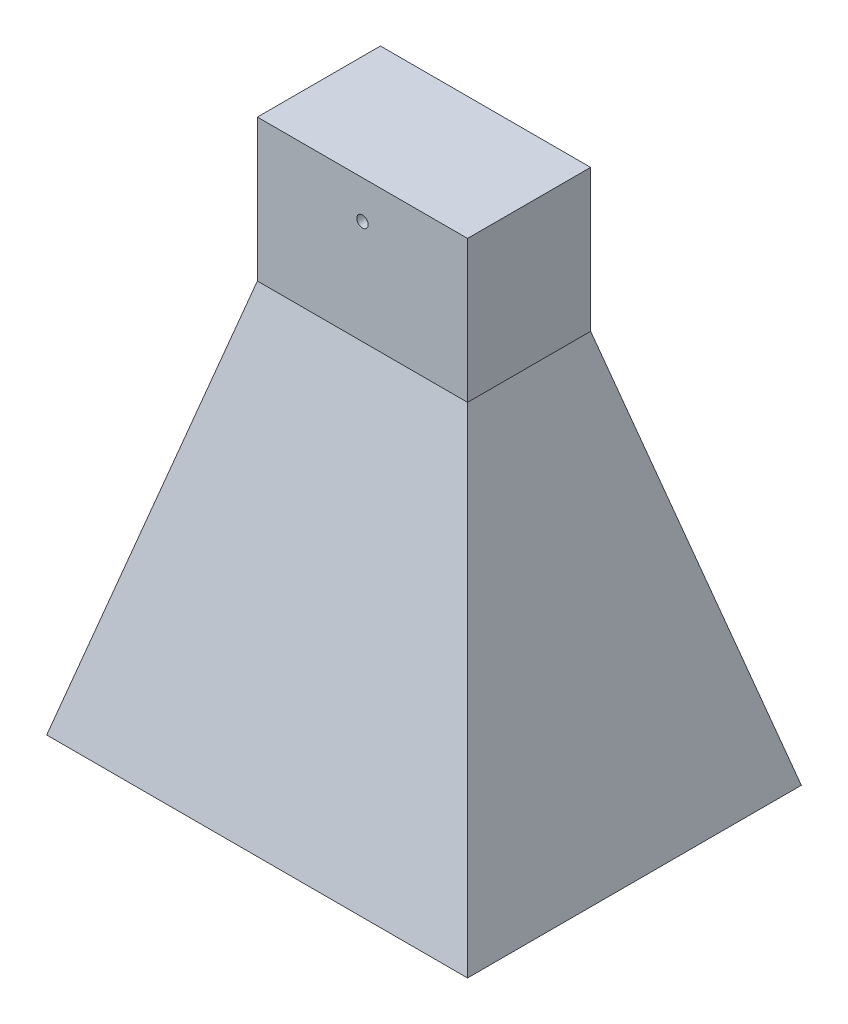
ISO-10303-21;
HEADER;
FILE_DESCRIPTION(('STEP AP214'),'2;1');
FILE_NAME('part.step','',(''),(''),'','','');
FILE_SCHEMA(('AUTOMOTIVE_DESIGN { 1 0 10303 214 1 1 1 1 }'));
ENDSEC;
DATA;
#1=APPLICATION_CONTEXT('core data for automotive mechanical design processes');
#2=APPLICATION_PROTOCOL_DEFINITION('international standard','automotive_design',2000,#1);
#3=PRODUCT_CONTEXT('',#1,'mechanical');
#4=PRODUCT('Part','Part','',(#3));
#5=PRODUCT_RELATED_PRODUCT_CATEGORY('part','',(#4));
#6=PRODUCT_DEFINITION_FORMATION('','',#4);
#7=PRODUCT_DEFINITION_CONTEXT('part definition',#1,'design');
#8=PRODUCT_DEFINITION('design','',#6,#7);
#9=PRODUCT_DEFINITION_SHAPE('','',#8);
#10=(LENGTH_UNIT() NAMED_UNIT(*) SI_UNIT(.MILLI.,.METRE.));
#11=(NAMED_UNIT(*) PLANE_ANGLE_UNIT() SI_UNIT($,.RADIAN.));
#12=(NAMED_UNIT(*) SI_UNIT($,.STERADIAN.) SOLID_ANGLE_UNIT());
#13=UNCERTAINTY_MEASURE_WITH_UNIT(LENGTH_MEASURE(1.E-05),#10,'distance_accuracy_value','');
#14=(GEOMETRIC_REPRESENTATION_CONTEXT(3) GLOBAL_UNCERTAINTY_ASSIGNED_CONTEXT((#13)) GLOBAL_UNIT_ASSIGNED_CONTEXT((#10,
#11,#12)) REPRESENTATION_CONTEXT('',''));
#15=CARTESIAN_POINT('',(0.,0.,0.));
#16=DIRECTION('',(0.,0.,1.));
#17=DIRECTION('',(1.,0.,0.));
#18=AXIS2_PLACEMENT_3D('',#15,#16,#17);
#19=CARTESIAN_POINT('',(0.,0.,-590.));
#20=DIRECTION('',(0.,0.258819045102521,-0.965925826289068));
#21=DIRECTION('',(0.,0.965925826289068,0.258819045102521));
#22=AXIS2_PLACEMENT_3D('',#19,#20,#21);
#23=PLANE('',#22);
#24=DIRECTION('',(1.,0.,0.));
#25=VECTOR('',#24,1.);
#26=CARTESIAN_POINT('',(0.,0.,-590.));
#27=LINE('',#26,#25);
#28=CARTESIAN_POINT('',(0.,0.,-590.));
#29=VERTEX_POINT('',#28);
#30=CARTESIAN_POINT('',(744.,0.,-590.));
#31=VERTEX_POINT('',#30);
#32=EDGE_CURVE('E178',#29,#31,#27,.T.);
#33=ORIENTED_EDGE('',*,*,#32,.F.);
#34=DIRECTION('',(-0.250562807085732,-0.935113126531029,-0.250562807085732));
#35=VECTOR('',#34,1.);
#36=CARTESIAN_POINT('',(37.0412149738623,138.239696256535,-552.958785026138));
#37=LINE('',#36,#35);
#38=CARTESIAN_POINT('',(186.224688739631,695.,-403.775311260369));
#39=VERTEX_POINT('',#38);
#40=EDGE_CURVE('E11',#39,#29,#37,.T.);
#41=ORIENTED_EDGE('',*,*,#40,.F.);
#42=DIRECTION('',(1.,0.,0.));
#43=VECTOR('',#42,1.);
#44=CARTESIAN_POINT('',(0.,695.,-403.775311260369));
#45=LINE('',#44,#43);
#46=CARTESIAN_POINT('',(557.775311260369,695.,-403.775311260369));
#47=VERTEX_POINT('',#46);
#48=EDGE_CURVE('E188',#39,#47,#45,.T.);
#49=ORIENTED_EDGE('',*,*,#48,.T.);
#50=DIRECTION('',(-0.250562807085732,0.935113126531029,0.250562807085732));
#51=VECTOR('',#50,1.);
#52=CARTESIAN_POINT('',(706.958785026138,138.239696256535,-552.958785026138));
#53=LINE('',#52,#51);
#54=EDGE_CURVE('E190',#47,#31,#53,.F.);
#55=ORIENTED_EDGE('',*,*,#54,.T.);
#56=EDGE_LOOP('',(#33,#41,#49,#55));
#57=FACE_BOUND('',#56,.T.);
#58=ADVANCED_FACE('F33',(#57),#23,.T.);
#59=CARTESIAN_POINT('',(0.,0.,0.));
#60=DIRECTION('',(-0.965925826289068,0.258819045102521,0.));
#61=DIRECTION('',(-0.258819045102521,-0.965925826289068,0.));
#62=AXIS2_PLACEMENT_3D('',#59,#60,#61);
#63=PLANE('',#62);
#64=DIRECTION('',(0.,0.,-1.));
#65=VECTOR('',#64,1.);
#66=CARTESIAN_POINT('',(0.,0.,0.));
#67=LINE('',#66,#65);
#68=CARTESIAN_POINT('',(0.,0.,0.));
#69=VERTEX_POINT('',#68);
#70=EDGE_CURVE('E186',#69,#29,#67,.T.);
#71=ORIENTED_EDGE('',*,*,#70,.F.);
#72=DIRECTION('',(0.250562807085732,0.935113126531029,-0.250562807085732));
#73=VECTOR('',#72,1.);
#74=CARTESIAN_POINT('',(0.,0.,0.));
#75=LINE('',#74,#73);
#76=CARTESIAN_POINT('',(186.224688739631,695.,-186.224688739631));
#77=VERTEX_POINT('',#76);
#78=EDGE_CURVE('E42',#77,#69,#75,.F.);
#79=ORIENTED_EDGE('',*,*,#78,.F.);
#80=DIRECTION('',(0.,0.,-1.));
#81=VECTOR('',#80,1.);
#82=CARTESIAN_POINT('',(186.224688739631,695.,0.));
#83=LINE('',#82,#81);
#84=EDGE_CURVE('E192',#77,#39,#83,.T.);
#85=ORIENTED_EDGE('',*,*,#84,.T.);
#86=ORIENTED_EDGE('',*,*,#40,.T.);
#87=EDGE_LOOP('',(#71,#79,#85,#86));
#88=FACE_BOUND('',#87,.T.);
#89=ADVANCED_FACE('F35',(#88),#63,.T.);
#90=CARTESIAN_POINT('',(0.,0.,0.));
#91=DIRECTION('',(0.,0.258819045102521,0.965925826289068));
#92=DIRECTION('',(0.,-0.965925826289068,0.258819045102521));
#93=AXIS2_PLACEMENT_3D('',#90,#91,#92);
#94=PLANE('',#93);
#95=DIRECTION('',(1.,0.,0.));
#96=VECTOR('',#95,1.);
#97=CARTESIAN_POINT('',(0.,0.,0.));
#98=LINE('',#97,#96);
#99=CARTESIAN_POINT('',(744.,0.,0.));
#100=VERTEX_POINT('',#99);
#101=EDGE_CURVE('E184',#69,#100,#98,.T.);
#102=ORIENTED_EDGE('',*,*,#101,.T.);
#103=DIRECTION('',(0.250562807085732,-0.935113126531029,0.250562807085732));
#104=VECTOR('',#103,1.);
#105=CARTESIAN_POINT('',(744.,0.,0.));
#106=LINE('',#105,#104);
#107=CARTESIAN_POINT('',(557.775311260369,695.,-186.224688739631));
#108=VERTEX_POINT('',#107);
#109=EDGE_CURVE('E70',#108,#100,#106,.T.);
#110=ORIENTED_EDGE('',*,*,#109,.F.);
#111=DIRECTION('',(-1.,0.,0.));
#112=VECTOR('',#111,1.);
#113=CARTESIAN_POINT('',(0.,695.,-186.224688739631));
#114=LINE('',#113,#112);
#115=EDGE_CURVE('E196',#77,#108,#114,.F.);
#116=ORIENTED_EDGE('',*,*,#115,.F.);
#117=ORIENTED_EDGE('',*,*,#78,.T.);
#118=EDGE_LOOP('',(#102,#110,#116,#117));
#119=FACE_BOUND('',#118,.T.);
#120=ADVANCED_FACE('F238',(#119),#94,.T.);
#121=CARTESIAN_POINT('',(744.,0.,0.));
#122=DIRECTION('',(0.965925826289068,0.258819045102521,0.));
#123=DIRECTION('',(-0.258819045102521,0.965925826289068,0.));
#124=AXIS2_PLACEMENT_3D('',#121,#122,#123);
#125=PLANE('',#124);
#126=DIRECTION('',(0.,0.,-1.));
#127=VECTOR('',#126,1.);
#128=CARTESIAN_POINT('',(744.,0.,0.));
#129=LINE('',#128,#127);
#130=EDGE_CURVE('E181',#100,#31,#129,.T.);
#131=ORIENTED_EDGE('',*,*,#130,.T.);
#132=ORIENTED_EDGE('',*,*,#54,.F.);
#133=DIRECTION('',(0.,0.,1.));
#134=VECTOR('',#133,1.);
#135=CARTESIAN_POINT('',(557.775311260369,695.,0.));
#136=LINE('',#135,#134);
#137=EDGE_CURVE('E37',#108,#47,#136,.F.);
#138=ORIENTED_EDGE('',*,*,#137,.F.);
#139=ORIENTED_EDGE('',*,*,#109,.T.);
#140=EDGE_LOOP('',(#131,#132,#138,#139));
#141=FACE_BOUND('',#140,.T.);
#142=ADVANCED_FACE('F243',(#141),#125,.T.);
#143=CARTESIAN_POINT('',(0.,0.,0.));
#144=DIRECTION('',(0.,1.,0.));
#145=DIRECTION('',(0.,0.,1.));
#146=AXIS2_PLACEMENT_3D('',#143,#144,#145);
#147=PLANE('',#146);
#148=DIRECTION('',(1.,0.,0.));
#149=VECTOR('',#148,1.);
#150=CARTESIAN_POINT('',(5.,0.,-585.));
#151=LINE('',#150,#149);
#152=CARTESIAN_POINT('',(5.,0.,-585.));
#153=VERTEX_POINT('',#152);
#154=CARTESIAN_POINT('',(739.,0.,-585.));
#155=VERTEX_POINT('',#154);
#156=EDGE_CURVE('E144',#153,#155,#151,.T.);
#157=ORIENTED_EDGE('',*,*,#156,.F.);
#158=DIRECTION('',(0.,0.,-1.));
#159=VECTOR('',#158,1.);
#160=CARTESIAN_POINT('',(5.,0.,-5.));
#161=LINE('',#160,#159);
#162=CARTESIAN_POINT('',(5.,0.,-5.));
#163=VERTEX_POINT('',#162);
#164=EDGE_CURVE('E50',#163,#153,#161,.T.);
#165=ORIENTED_EDGE('',*,*,#164,.F.);
#166=DIRECTION('',(-1.,0.,0.));
#167=VECTOR('',#166,1.);
#168=CARTESIAN_POINT('',(739.,0.,-5.));
#169=LINE('',#168,#167);
#170=CARTESIAN_POINT('',(739.,0.,-5.));
#171=VERTEX_POINT('',#170);
#172=EDGE_CURVE('E155',#171,#163,#169,.T.);
#173=ORIENTED_EDGE('',*,*,#172,.F.);
#174=DIRECTION('',(0.,0.,1.));
#175=VECTOR('',#174,1.);
#176=CARTESIAN_POINT('',(739.,0.,-585.));
#177=LINE('',#176,#175);
#178=EDGE_CURVE('E152',#155,#171,#177,.T.);
#179=ORIENTED_EDGE('',*,*,#178,.F.);
#180=EDGE_LOOP('',(#157,#165,#173,#179));
#181=FACE_BOUND('',#180,.T.);
#182=ORIENTED_EDGE('',*,*,#32,.T.);
#183=ORIENTED_EDGE('',*,*,#130,.F.);
#184=ORIENTED_EDGE('',*,*,#101,.F.);
#185=ORIENTED_EDGE('',*,*,#70,.T.);
#186=EDGE_LOOP('',(#182,#183,#184,#185));
#187=FACE_BOUND('',#186,.T.);
#188=ADVANCED_FACE('F241',(#181,#187),#147,.F.);
#189=CARTESIAN_POINT('',(5.,0.,-5.));
#190=DIRECTION('',(-0.965925826289068,0.258819045102521,0.));
#191=DIRECTION('',(-0.258819045102521,-0.965925826289068,0.));
#192=AXIS2_PLACEMENT_3D('',#189,#190,#191);
#193=PLANE('',#192);
#194=DIRECTION('',(0.,0.,1.));
#195=VECTOR('',#194,1.);
#196=CARTESIAN_POINT('',(191.224688739631,695.,0.));
#197=LINE('',#196,#195);
#198=CARTESIAN_POINT('',(191.224688739631,695.,-398.775311260369));
#199=VERTEX_POINT('',#198);
#200=CARTESIAN_POINT('',(191.224688739631,695.,-191.224688739631));
#201=VERTEX_POINT('',#200);
#202=EDGE_CURVE('E175',#199,#201,#197,.T.);
#203=ORIENTED_EDGE('',*,*,#202,.T.);
#204=DIRECTION('',(-0.250562807085732,-0.935113126531029,0.250562807085732));
#205=VECTOR('',#204,1.);
#206=CARTESIAN_POINT('',(51.0817826962964,171.979554325926,-51.0817826962965));
#207=LINE('',#206,#205);
#208=EDGE_CURVE('E159',#201,#163,#207,.T.);
#209=ORIENTED_EDGE('',*,*,#208,.T.);
#210=ORIENTED_EDGE('',*,*,#164,.T.);
#211=DIRECTION('',(-0.250562807085732,-0.935113126531029,-0.250562807085732));
#212=VECTOR('',#211,1.);
#213=CARTESIAN_POINT('',(41.4133977709154,135.896650557271,-548.586602229085));
#214=LINE('',#213,#212);
#215=EDGE_CURVE('E158',#199,#153,#214,.T.);
#216=ORIENTED_EDGE('',*,*,#215,.F.);
#217=EDGE_LOOP('',(#203,#209,#210,#216));
#218=FACE_BOUND('',#217,.T.);
#219=ADVANCED_FACE('F253',(#218),#193,.F.);
#220=CARTESIAN_POINT('',(739.,0.,-5.));
#221=DIRECTION('',(0.,0.258819045102521,0.965925826289068));
#222=DIRECTION('',(0.,-0.965925826289068,0.258819045102521));
#223=AXIS2_PLACEMENT_3D('',#220,#221,#222);
#224=PLANE('',#223);
#225=DIRECTION('',(1.,0.,0.));
#226=VECTOR('',#225,1.);
#227=CARTESIAN_POINT('',(0.,695.,-191.224688739631));
#228=LINE('',#227,#226);
#229=CARTESIAN_POINT('',(552.775311260369,695.,-191.224688739631));
#230=VERTEX_POINT('',#229);
#231=EDGE_CURVE('E172',#201,#230,#228,.T.);
#232=ORIENTED_EDGE('',*,*,#231,.T.);
#233=DIRECTION('',(0.250562807085732,-0.935113126531029,0.250562807085732));
#234=VECTOR('',#233,1.);
#235=CARTESIAN_POINT('',(702.586602229085,135.896650557271,-41.4133977709155));
#236=LINE('',#235,#234);
#237=EDGE_CURVE('E162',#230,#171,#236,.T.);
#238=ORIENTED_EDGE('',*,*,#237,.T.);
#239=ORIENTED_EDGE('',*,*,#172,.T.);
#240=ORIENTED_EDGE('',*,*,#208,.F.);
#241=EDGE_LOOP('',(#232,#238,#239,#240));
#242=FACE_BOUND('',#241,.T.);
#243=ADVANCED_FACE('F258',(#242),#224,.F.);
#244=CARTESIAN_POINT('',(739.,0.,-585.));
#245=DIRECTION('',(0.965925826289068,0.258819045102521,0.));
#246=DIRECTION('',(-0.258819045102521,0.965925826289068,0.));
#247=AXIS2_PLACEMENT_3D('',#244,#245,#246);
#248=PLANE('',#247);
#249=DIRECTION('',(0.,0.,-1.));
#250=VECTOR('',#249,1.);
#251=CARTESIAN_POINT('',(552.775311260369,695.,0.));
#252=LINE('',#251,#250);
#253=CARTESIAN_POINT('',(552.775311260369,695.,-398.775311260369));
#254=VERTEX_POINT('',#253);
#255=EDGE_CURVE('E169',#230,#254,#252,.T.);
#256=ORIENTED_EDGE('',*,*,#255,.T.);
#257=DIRECTION('',(0.250562807085732,-0.935113126531029,-0.250562807085732));
#258=VECTOR('',#257,1.);
#259=CARTESIAN_POINT('',(692.918217303704,171.979554325926,-538.918217303703));
#260=LINE('',#259,#258);
#261=EDGE_CURVE('E164',#254,#155,#260,.T.);
#262=ORIENTED_EDGE('',*,*,#261,.T.);
#263=ORIENTED_EDGE('',*,*,#178,.T.);
#264=ORIENTED_EDGE('',*,*,#237,.F.);
#265=EDGE_LOOP('',(#256,#262,#263,#264));
#266=FACE_BOUND('',#265,.T.);
#267=ADVANCED_FACE('F271',(#266),#248,.F.);
#268=CARTESIAN_POINT('',(5.,0.,-585.));
#269=DIRECTION('',(0.,0.258819045102521,-0.965925826289068));
#270=DIRECTION('',(0.,0.965925826289068,0.258819045102521));
#271=AXIS2_PLACEMENT_3D('',#268,#269,#270);
#272=PLANE('',#271);
#273=DIRECTION('',(-1.,0.,0.));
#274=VECTOR('',#273,1.);
#275=CARTESIAN_POINT('',(0.,695.,-398.775311260369));
#276=LINE('',#275,#274);
#277=EDGE_CURVE('E161',#254,#199,#276,.T.);
#278=ORIENTED_EDGE('',*,*,#277,.T.);
#279=ORIENTED_EDGE('',*,*,#215,.T.);
#280=ORIENTED_EDGE('',*,*,#156,.T.);
#281=ORIENTED_EDGE('',*,*,#261,.F.);
#282=EDGE_LOOP('',(#278,#279,#280,#281));
#283=FACE_BOUND('',#282,.T.);
#284=ADVANCED_FACE('F265',(#283),#272,.F.);
#285=CARTESIAN_POINT('',(0.,695.,0.));
#286=DIRECTION('',(0.,1.,0.));
#287=DIRECTION('',(0.,0.,1.));
#288=AXIS2_PLACEMENT_3D('',#285,#286,#287);
#289=PLANE('',#288);
#290=ORIENTED_EDGE('',*,*,#202,.F.);
#291=ORIENTED_EDGE('',*,*,#277,.F.);
#292=ORIENTED_EDGE('',*,*,#255,.F.);
#293=ORIENTED_EDGE('',*,*,#231,.F.);
#294=EDGE_LOOP('',(#290,#291,#292,#293));
#295=FACE_BOUND('',#294,.T.);
#296=ADVANCED_FACE('F272',(#295),#289,.F.);
#297=CARTESIAN_POINT('',(557.775311260369,946.,-186.224688739631));
#298=DIRECTION('',(-1.,0.,0.));
#299=DIRECTION('',(0.,0.,1.));
#300=AXIS2_PLACEMENT_3D('',#297,#298,#299);
#301=PLANE('',#300);
#302=ORIENTED_EDGE('',*,*,#137,.T.);
#303=DIRECTION('',(0.,-1.,0.));
#304=VECTOR('',#303,1.);
#305=CARTESIAN_POINT('',(557.775311260369,946.,-403.775311260369));
#306=LINE('',#305,#304);
#307=CARTESIAN_POINT('',(557.775311260369,946.,-403.775311260369));
#308=VERTEX_POINT('',#307);
#309=EDGE_CURVE('E124',#308,#47,#306,.T.);
#310=ORIENTED_EDGE('',*,*,#309,.F.);
#311=DIRECTION('',(0.,0.,-1.));
#312=VECTOR('',#311,1.);
#313=CARTESIAN_POINT('',(557.775311260369,946.,-186.224688739631));
#314=LINE('',#313,#312);
#315=CARTESIAN_POINT('',(557.775311260369,946.,-186.224688739631));
#316=VERTEX_POINT('',#315);
#317=EDGE_CURVE('E131',#316,#308,#314,.T.);
#318=ORIENTED_EDGE('',*,*,#317,.F.);
#319=DIRECTION('',(0.,-1.,0.));
#320=VECTOR('',#319,1.);
#321=CARTESIAN_POINT('',(557.775311260369,946.,-186.224688739631));
#322=LINE('',#321,#320);
#323=EDGE_CURVE('E201',#316,#108,#322,.T.);
#324=ORIENTED_EDGE('',*,*,#323,.T.);
#325=EDGE_LOOP('',(#302,#310,#318,#324));
#326=FACE_BOUND('',#325,.T.);
#327=ADVANCED_FACE('F142',(#326),#301,.F.);
#328=CARTESIAN_POINT('',(557.775311260369,946.,-403.775311260369));
#329=DIRECTION('',(0.,0.,1.));
#330=DIRECTION('',(1.,0.,0.));
#331=AXIS2_PLACEMENT_3D('',#328,#329,#330);
#332=PLANE('',#331);
#333=ORIENTED_EDGE('',*,*,#48,.F.);
#334=DIRECTION('',(0.,-1.,0.));
#335=VECTOR('',#334,1.);
#336=CARTESIAN_POINT('',(186.224688739631,946.,-403.775311260369));
#337=LINE('',#336,#335);
#338=CARTESIAN_POINT('',(186.224688739631,946.,-403.775311260369));
#339=VERTEX_POINT('',#338);
#340=EDGE_CURVE('E127',#339,#39,#337,.T.);
#341=ORIENTED_EDGE('',*,*,#340,.F.);
#342=DIRECTION('',(-1.,0.,0.));
#343=VECTOR('',#342,1.);
#344=CARTESIAN_POINT('',(557.775311260369,946.,-403.775311260369));
#345=LINE('',#344,#343);
#346=EDGE_CURVE('E119',#308,#339,#345,.T.);
#347=ORIENTED_EDGE('',*,*,#346,.F.);
#348=ORIENTED_EDGE('',*,*,#309,.T.);
#349=EDGE_LOOP('',(#333,#341,#347,#348));
#350=FACE_BOUND('',#349,.T.);
#351=ADVANCED_FACE('F122',(#350),#332,.F.);
#352=CARTESIAN_POINT('',(186.224688739631,946.,-403.775311260369));
#353=DIRECTION('',(1.,0.,0.));
#354=DIRECTION('',(0.,0.,-1.));
#355=AXIS2_PLACEMENT_3D('',#352,#353,#354);
#356=PLANE('',#355);
#357=ORIENTED_EDGE('',*,*,#84,.F.);
#358=DIRECTION('',(0.,-1.,0.));
#359=VECTOR('',#358,1.);
#360=CARTESIAN_POINT('',(186.224688739631,946.,-186.224688739631));
#361=LINE('',#360,#359);
#362=CARTESIAN_POINT('',(186.224688739631,946.,-186.224688739631));
#363=VERTEX_POINT('',#362);
#364=EDGE_CURVE('E146',#363,#77,#361,.T.);
#365=ORIENTED_EDGE('',*,*,#364,.F.);
#366=DIRECTION('',(0.,0.,1.));
#367=VECTOR('',#366,1.);
#368=CARTESIAN_POINT('',(186.224688739631,946.,-403.775311260369));
#369=LINE('',#368,#367);
#370=EDGE_CURVE('E130',#339,#363,#369,.T.);
#371=ORIENTED_EDGE('',*,*,#370,.F.);
#372=ORIENTED_EDGE('',*,*,#340,.T.);
#373=EDGE_LOOP('',(#357,#365,#371,#372));
#374=FACE_BOUND('',#373,.T.);
#375=ADVANCED_FACE('F223',(#374),#356,.F.);
#376=CARTESIAN_POINT('',(186.224688739631,946.,-186.224688739631));
#377=DIRECTION('',(0.,0.,-1.));
#378=DIRECTION('',(-1.,0.,0.));
#379=AXIS2_PLACEMENT_3D('',#376,#377,#378);
#380=PLANE('',#379);
#381=CARTESIAN_POINT('',(372.,879.,-186.224688739631));
#382=DIRECTION('',(0.,0.,1.));
#383=DIRECTION('',(1.,0.,0.));
#384=AXIS2_PLACEMENT_3D('',#381,#382,#383);
#385=CIRCLE('',#384,9.99999999999998);
#386=CARTESIAN_POINT('',(382.,879.,-186.224688739631));
#387=VERTEX_POINT('',#386);
#388=EDGE_CURVE('E208',#387,#387,#385,.T.);
#389=ORIENTED_EDGE('',*,*,#388,.F.);
#390=EDGE_LOOP('',(#389));
#391=FACE_BOUND('',#390,.T.);
#392=ORIENTED_EDGE('',*,*,#115,.T.);
#393=ORIENTED_EDGE('',*,*,#323,.F.);
#394=DIRECTION('',(1.,0.,0.));
#395=VECTOR('',#394,1.);
#396=CARTESIAN_POINT('',(186.224688739631,946.,-186.224688739631));
#397=LINE('',#396,#395);
#398=EDGE_CURVE('E136',#363,#316,#397,.T.);
#399=ORIENTED_EDGE('',*,*,#398,.F.);
#400=ORIENTED_EDGE('',*,*,#364,.T.);
#401=EDGE_LOOP('',(#392,#393,#399,#400));
#402=FACE_BOUND('',#401,.T.);
#403=ADVANCED_FACE('F200',(#391,#402),#380,.F.);
#404=CARTESIAN_POINT('',(0.,946.,0.));
#405=DIRECTION('',(0.,1.,0.));
#406=DIRECTION('',(0.,0.,1.));
#407=AXIS2_PLACEMENT_3D('',#404,#405,#406);
#408=PLANE('',#407);
#409=ORIENTED_EDGE('',*,*,#317,.T.);
#410=ORIENTED_EDGE('',*,*,#346,.T.);
#411=ORIENTED_EDGE('',*,*,#370,.T.);
#412=ORIENTED_EDGE('',*,*,#398,.T.);
#413=EDGE_LOOP('',(#409,#410,#411,#412));
#414=FACE_BOUND('',#413,.T.);
#415=ADVANCED_FACE('F134',(#414),#408,.T.);
#416=CARTESIAN_POINT('',(372.,879.,-286.224688739631));
#417=DIRECTION('',(0.,0.,1.));
#418=DIRECTION('',(1.,0.,0.));
#419=AXIS2_PLACEMENT_3D('',#416,#417,#418);
#420=CYLINDRICAL_SURFACE('',#419,9.99999999999998);
#421=CARTESIAN_POINT('',(372.,879.,-286.224688739631));
#422=DIRECTION('',(0.,0.,1.));
#423=DIRECTION('',(1.,0.,0.));
#424=AXIS2_PLACEMENT_3D('',#421,#422,#423);
#425=CIRCLE('',#424,9.99999999999998);
#426=CARTESIAN_POINT('',(382.,879.,-286.224688739631));
#427=VERTEX_POINT('',#426);
#428=EDGE_CURVE('E140',#427,#427,#425,.T.);
#429=ORIENTED_EDGE('',*,*,#428,.F.);
#430=EDGE_LOOP('',(#429));
#431=FACE_BOUND('',#430,.T.);
#432=ORIENTED_EDGE('',*,*,#388,.T.);
#433=EDGE_LOOP('',(#432));
#434=FACE_BOUND('',#433,.T.);
#435=ADVANCED_FACE('F216',(#431,#434),#420,.F.);
#436=CARTESIAN_POINT('',(372.,879.,-286.224688739631));
#437=DIRECTION('',(0.,0.,1.));
#438=DIRECTION('',(1.,0.,0.));
#439=AXIS2_PLACEMENT_3D('',#436,#437,#438);
#440=PLANE('',#439);
#441=ORIENTED_EDGE('',*,*,#428,.T.);
#442=EDGE_LOOP('',(#441));
#443=FACE_BOUND('',#442,.T.);
#444=ADVANCED_FACE('F214',(#443),#440,.T.);
#445=CLOSED_SHELL('',(#58,#89,#120,#142,#188,#219,#243,#267,#284,#296,#327,#351,#375,#403,#415,
#435,#444));
#446=MANIFOLD_SOLID_BREP('B2',#445);
#447=ADVANCED_BREP_SHAPE_REPRESENTATION('',(#18,#446),#14);
#448=SHAPE_DEFINITION_REPRESENTATION(#9,#447);
ENDSEC;
END-ISO-10303-21;
